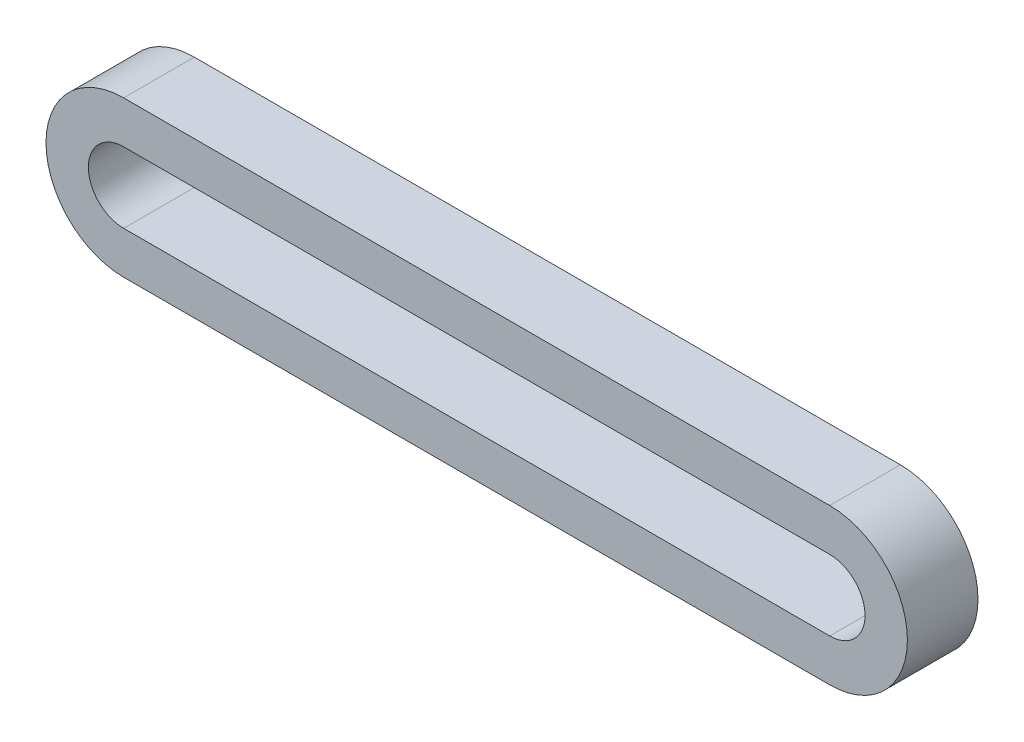
ISO-10303-21;
HEADER;
FILE_DESCRIPTION(('STEP AP214'),'2;1');
FILE_NAME('part.step','',(''),(''),'','','');
FILE_SCHEMA(('AUTOMOTIVE_DESIGN { 1 0 10303 214 1 1 1 1 }'));
ENDSEC;
DATA;
#1=APPLICATION_CONTEXT('core data for automotive mechanical design processes');
#2=APPLICATION_PROTOCOL_DEFINITION('international standard','automotive_design',2000,#1);
#3=PRODUCT_CONTEXT('',#1,'mechanical');
#4=PRODUCT('Part','Part','',(#3));
#5=PRODUCT_RELATED_PRODUCT_CATEGORY('part','',(#4));
#6=PRODUCT_DEFINITION_FORMATION('','',#4);
#7=PRODUCT_DEFINITION_CONTEXT('part definition',#1,'design');
#8=PRODUCT_DEFINITION('design','',#6,#7);
#9=PRODUCT_DEFINITION_SHAPE('','',#8);
#10=(LENGTH_UNIT() NAMED_UNIT(*) SI_UNIT(.MILLI.,.METRE.));
#11=(NAMED_UNIT(*) PLANE_ANGLE_UNIT() SI_UNIT($,.RADIAN.));
#12=(NAMED_UNIT(*) SI_UNIT($,.STERADIAN.) SOLID_ANGLE_UNIT());
#13=UNCERTAINTY_MEASURE_WITH_UNIT(LENGTH_MEASURE(1.E-05),#10,'distance_accuracy_value','');
#14=(GEOMETRIC_REPRESENTATION_CONTEXT(3) GLOBAL_UNCERTAINTY_ASSIGNED_CONTEXT((#13)) GLOBAL_UNIT_ASSIGNED_CONTEXT((#10,
#11,#12)) REPRESENTATION_CONTEXT('',''));
#15=CARTESIAN_POINT('',(0.,0.,0.));
#16=DIRECTION('',(0.,0.,1.));
#17=DIRECTION('',(1.,0.,0.));
#18=AXIS2_PLACEMENT_3D('',#15,#16,#17);
#19=CARTESIAN_POINT('',(0.,5.5,5.));
#20=DIRECTION('',(0.,1.,0.));
#21=DIRECTION('',(0.,0.,1.));
#22=AXIS2_PLACEMENT_3D('',#19,#20,#21);
#23=PLANE('',#22);
#24=DIRECTION('',(1.,0.,0.));
#25=VECTOR('',#24,1.);
#26=CARTESIAN_POINT('',(0.,5.5,0.));
#27=LINE('',#26,#25);
#28=CARTESIAN_POINT('',(0.,5.5,0.));
#29=VERTEX_POINT('',#28);
#30=CARTESIAN_POINT('',(50.,5.5,0.));
#31=VERTEX_POINT('',#30);
#32=EDGE_CURVE('E148',#29,#31,#27,.T.);
#33=ORIENTED_EDGE('',*,*,#32,.F.);
#34=DIRECTION('',(0.,0.,-1.));
#35=VECTOR('',#34,1.);
#36=CARTESIAN_POINT('',(0.,5.5,5.));
#37=LINE('',#36,#35);
#38=CARTESIAN_POINT('',(0.,5.5,5.));
#39=VERTEX_POINT('',#38);
#40=EDGE_CURVE('E11',#39,#29,#37,.T.);
#41=ORIENTED_EDGE('',*,*,#40,.F.);
#42=DIRECTION('',(1.,0.,0.));
#43=VECTOR('',#42,1.);
#44=CARTESIAN_POINT('',(0.,5.5,5.));
#45=LINE('',#44,#43);
#46=CARTESIAN_POINT('',(50.,5.5,5.));
#47=VERTEX_POINT('',#46);
#48=EDGE_CURVE('E122',#39,#47,#45,.T.);
#49=ORIENTED_EDGE('',*,*,#48,.T.);
#50=DIRECTION('',(0.,0.,-1.));
#51=VECTOR('',#50,1.);
#52=CARTESIAN_POINT('',(50.,5.5,5.));
#53=LINE('',#52,#51);
#54=EDGE_CURVE('E88',#47,#31,#53,.T.);
#55=ORIENTED_EDGE('',*,*,#54,.T.);
#56=EDGE_LOOP('',(#33,#41,#49,#55));
#57=FACE_BOUND('',#56,.T.);
#58=ADVANCED_FACE('F35',(#57),#23,.T.);
#59=CARTESIAN_POINT('',(0.,0.,5.));
#60=DIRECTION('',(0.,0.,-1.));
#61=DIRECTION('',(-1.,0.,0.));
#62=AXIS2_PLACEMENT_3D('',#59,#60,#61);
#63=CYLINDRICAL_SURFACE('',#62,5.5);
#64=CARTESIAN_POINT('',(0.,0.,0.));
#65=DIRECTION('',(0.,0.,1.));
#66=DIRECTION('',(1.,0.,0.));
#67=AXIS2_PLACEMENT_3D('',#64,#65,#66);
#68=CIRCLE('',#67,5.5);
#69=CARTESIAN_POINT('',(0.,-5.5,0.));
#70=VERTEX_POINT('',#69);
#71=EDGE_CURVE('E127',#29,#70,#68,.T.);
#72=ORIENTED_EDGE('',*,*,#71,.T.);
#73=DIRECTION('',(0.,0.,-1.));
#74=VECTOR('',#73,1.);
#75=CARTESIAN_POINT('',(0.,-5.5,5.));
#76=LINE('',#75,#74);
#77=CARTESIAN_POINT('',(0.,-5.5,5.));
#78=VERTEX_POINT('',#77);
#79=EDGE_CURVE('E45',#78,#70,#76,.T.);
#80=ORIENTED_EDGE('',*,*,#79,.F.);
#81=CARTESIAN_POINT('',(0.,0.,5.));
#82=DIRECTION('',(0.,0.,1.));
#83=DIRECTION('',(1.,0.,0.));
#84=AXIS2_PLACEMENT_3D('',#81,#82,#83);
#85=CIRCLE('',#84,5.5);
#86=EDGE_CURVE('E118',#39,#78,#85,.T.);
#87=ORIENTED_EDGE('',*,*,#86,.F.);
#88=ORIENTED_EDGE('',*,*,#40,.T.);
#89=EDGE_LOOP('',(#72,#80,#87,#88));
#90=FACE_BOUND('',#89,.T.);
#91=ADVANCED_FACE('F125',(#90),#63,.T.);
#92=CARTESIAN_POINT('',(0.,-5.5,5.));
#93=DIRECTION('',(0.,1.,0.));
#94=DIRECTION('',(0.,0.,1.));
#95=AXIS2_PLACEMENT_3D('',#92,#93,#94);
#96=PLANE('',#95);
#97=DIRECTION('',(1.,0.,0.));
#98=VECTOR('',#97,1.);
#99=CARTESIAN_POINT('',(0.,-5.5,0.));
#100=LINE('',#99,#98);
#101=CARTESIAN_POINT('',(50.,-5.5,0.));
#102=VERTEX_POINT('',#101);
#103=EDGE_CURVE('E145',#70,#102,#100,.T.);
#104=ORIENTED_EDGE('',*,*,#103,.T.);
#105=DIRECTION('',(0.,0.,-1.));
#106=VECTOR('',#105,1.);
#107=CARTESIAN_POINT('',(50.,-5.5,5.));
#108=LINE('',#107,#106);
#109=CARTESIAN_POINT('',(50.,-5.5,5.));
#110=VERTEX_POINT('',#109);
#111=EDGE_CURVE('E117',#110,#102,#108,.T.);
#112=ORIENTED_EDGE('',*,*,#111,.F.);
#113=DIRECTION('',(1.,0.,0.));
#114=VECTOR('',#113,1.);
#115=CARTESIAN_POINT('',(0.,-5.5,5.));
#116=LINE('',#115,#114);
#117=EDGE_CURVE('E111',#78,#110,#116,.T.);
#118=ORIENTED_EDGE('',*,*,#117,.F.);
#119=ORIENTED_EDGE('',*,*,#79,.T.);
#120=EDGE_LOOP('',(#104,#112,#118,#119));
#121=FACE_BOUND('',#120,.T.);
#122=ADVANCED_FACE('F114',(#121),#96,.F.);
#123=CARTESIAN_POINT('',(50.,0.,5.));
#124=DIRECTION('',(0.,0.,-1.));
#125=DIRECTION('',(-1.,0.,0.));
#126=AXIS2_PLACEMENT_3D('',#123,#124,#125);
#127=CYLINDRICAL_SURFACE('',#126,2.5);
#128=CARTESIAN_POINT('',(50.,0.,0.));
#129=DIRECTION('',(0.,0.,1.));
#130=DIRECTION('',(1.,0.,0.));
#131=AXIS2_PLACEMENT_3D('',#128,#129,#130);
#132=CIRCLE('',#131,2.5);
#133=CARTESIAN_POINT('',(50.,-2.5,0.));
#134=VERTEX_POINT('',#133);
#135=CARTESIAN_POINT('',(50.,2.5,0.));
#136=VERTEX_POINT('',#135);
#137=EDGE_CURVE('E159',#134,#136,#132,.T.);
#138=ORIENTED_EDGE('',*,*,#137,.F.);
#139=DIRECTION('',(0.,0.,-1.));
#140=VECTOR('',#139,1.);
#141=CARTESIAN_POINT('',(50.,-2.5,5.));
#142=LINE('',#141,#140);
#143=CARTESIAN_POINT('',(50.,-2.5,5.));
#144=VERTEX_POINT('',#143);
#145=EDGE_CURVE('E39',#144,#134,#142,.T.);
#146=ORIENTED_EDGE('',*,*,#145,.F.);
#147=CARTESIAN_POINT('',(50.,0.,5.));
#148=DIRECTION('',(0.,0.,1.));
#149=DIRECTION('',(1.,0.,0.));
#150=AXIS2_PLACEMENT_3D('',#147,#148,#149);
#151=CIRCLE('',#150,2.5);
#152=CARTESIAN_POINT('',(50.,2.5,5.));
#153=VERTEX_POINT('',#152);
#154=EDGE_CURVE('E144',#144,#153,#151,.T.);
#155=ORIENTED_EDGE('',*,*,#154,.T.);
#156=DIRECTION('',(0.,0.,-1.));
#157=VECTOR('',#156,1.);
#158=CARTESIAN_POINT('',(50.,2.5,5.));
#159=LINE('',#158,#157);
#160=EDGE_CURVE('E132',#153,#136,#159,.T.);
#161=ORIENTED_EDGE('',*,*,#160,.T.);
#162=EDGE_LOOP('',(#138,#146,#155,#161));
#163=FACE_BOUND('',#162,.T.);
#164=ADVANCED_FACE('F37',(#163),#127,.F.);
#165=CARTESIAN_POINT('',(0.,-2.5,5.));
#166=DIRECTION('',(0.,1.,0.));
#167=DIRECTION('',(0.,0.,1.));
#168=AXIS2_PLACEMENT_3D('',#165,#166,#167);
#169=PLANE('',#168);
#170=DIRECTION('',(1.,0.,0.));
#171=VECTOR('',#170,1.);
#172=CARTESIAN_POINT('',(0.,-2.5,0.));
#173=LINE('',#172,#171);
#174=CARTESIAN_POINT('',(0.,-2.5,0.));
#175=VERTEX_POINT('',#174);
#176=EDGE_CURVE('E156',#175,#134,#173,.T.);
#177=ORIENTED_EDGE('',*,*,#176,.F.);
#178=DIRECTION('',(0.,0.,-1.));
#179=VECTOR('',#178,1.);
#180=CARTESIAN_POINT('',(0.,-2.5,5.));
#181=LINE('',#180,#179);
#182=CARTESIAN_POINT('',(0.,-2.5,5.));
#183=VERTEX_POINT('',#182);
#184=EDGE_CURVE('E135',#183,#175,#181,.T.);
#185=ORIENTED_EDGE('',*,*,#184,.F.);
#186=DIRECTION('',(1.,0.,0.));
#187=VECTOR('',#186,1.);
#188=CARTESIAN_POINT('',(0.,-2.5,5.));
#189=LINE('',#188,#187);
#190=EDGE_CURVE('E168',#183,#144,#189,.T.);
#191=ORIENTED_EDGE('',*,*,#190,.T.);
#192=ORIENTED_EDGE('',*,*,#145,.T.);
#193=EDGE_LOOP('',(#177,#185,#191,#192));
#194=FACE_BOUND('',#193,.T.);
#195=ADVANCED_FACE('F175',(#194),#169,.T.);
#196=CARTESIAN_POINT('',(0.,0.,5.));
#197=DIRECTION('',(0.,0.,-1.));
#198=DIRECTION('',(-1.,0.,0.));
#199=AXIS2_PLACEMENT_3D('',#196,#197,#198);
#200=CYLINDRICAL_SURFACE('',#199,2.5);
#201=CARTESIAN_POINT('',(0.,0.,0.));
#202=DIRECTION('',(0.,0.,1.));
#203=DIRECTION('',(1.,0.,0.));
#204=AXIS2_PLACEMENT_3D('',#201,#202,#203);
#205=CIRCLE('',#204,2.5);
#206=CARTESIAN_POINT('',(0.,2.5,0.));
#207=VERTEX_POINT('',#206);
#208=EDGE_CURVE('E153',#207,#175,#205,.T.);
#209=ORIENTED_EDGE('',*,*,#208,.F.);
#210=DIRECTION('',(0.,0.,-1.));
#211=VECTOR('',#210,1.);
#212=CARTESIAN_POINT('',(0.,2.5,5.));
#213=LINE('',#212,#211);
#214=CARTESIAN_POINT('',(0.,2.5,5.));
#215=VERTEX_POINT('',#214);
#216=EDGE_CURVE('E134',#215,#207,#213,.T.);
#217=ORIENTED_EDGE('',*,*,#216,.F.);
#218=CARTESIAN_POINT('',(0.,0.,5.));
#219=DIRECTION('',(0.,0.,1.));
#220=DIRECTION('',(1.,0.,0.));
#221=AXIS2_PLACEMENT_3D('',#218,#219,#220);
#222=CIRCLE('',#221,2.5);
#223=EDGE_CURVE('E166',#215,#183,#222,.T.);
#224=ORIENTED_EDGE('',*,*,#223,.T.);
#225=ORIENTED_EDGE('',*,*,#184,.T.);
#226=EDGE_LOOP('',(#209,#217,#224,#225));
#227=FACE_BOUND('',#226,.T.);
#228=ADVANCED_FACE('F179',(#227),#200,.F.);
#229=CARTESIAN_POINT('',(0.,2.5,5.));
#230=DIRECTION('',(0.,1.,0.));
#231=DIRECTION('',(0.,0.,1.));
#232=AXIS2_PLACEMENT_3D('',#229,#230,#231);
#233=PLANE('',#232);
#234=DIRECTION('',(1.,0.,0.));
#235=VECTOR('',#234,1.);
#236=CARTESIAN_POINT('',(0.,2.5,0.));
#237=LINE('',#236,#235);
#238=EDGE_CURVE('E150',#207,#136,#237,.T.);
#239=ORIENTED_EDGE('',*,*,#238,.T.);
#240=ORIENTED_EDGE('',*,*,#160,.F.);
#241=DIRECTION('',(1.,0.,0.));
#242=VECTOR('',#241,1.);
#243=CARTESIAN_POINT('',(0.,2.5,5.));
#244=LINE('',#243,#242);
#245=EDGE_CURVE('E164',#215,#153,#244,.T.);
#246=ORIENTED_EDGE('',*,*,#245,.F.);
#247=ORIENTED_EDGE('',*,*,#216,.T.);
#248=EDGE_LOOP('',(#239,#240,#246,#247));
#249=FACE_BOUND('',#248,.T.);
#250=ADVANCED_FACE('F181',(#249),#233,.F.);
#251=CARTESIAN_POINT('',(50.,0.,5.));
#252=DIRECTION('',(0.,0.,-1.));
#253=DIRECTION('',(-1.,0.,0.));
#254=AXIS2_PLACEMENT_3D('',#251,#252,#253);
#255=CYLINDRICAL_SURFACE('',#254,5.5);
#256=CARTESIAN_POINT('',(50.,0.,0.));
#257=DIRECTION('',(0.,0.,1.));
#258=DIRECTION('',(1.,0.,0.));
#259=AXIS2_PLACEMENT_3D('',#256,#257,#258);
#260=CIRCLE('',#259,5.5);
#261=EDGE_CURVE('E81',#102,#31,#260,.T.);
#262=ORIENTED_EDGE('',*,*,#261,.T.);
#263=ORIENTED_EDGE('',*,*,#54,.F.);
#264=CARTESIAN_POINT('',(50.,0.,5.));
#265=DIRECTION('',(0.,0.,1.));
#266=DIRECTION('',(1.,0.,0.));
#267=AXIS2_PLACEMENT_3D('',#264,#265,#266);
#268=CIRCLE('',#267,5.5);
#269=EDGE_CURVE('E54',#110,#47,#268,.T.);
#270=ORIENTED_EDGE('',*,*,#269,.F.);
#271=ORIENTED_EDGE('',*,*,#111,.T.);
#272=EDGE_LOOP('',(#262,#263,#270,#271));
#273=FACE_BOUND('',#272,.T.);
#274=ADVANCED_FACE('F183',(#273),#255,.T.);
#275=CARTESIAN_POINT('',(0.,0.,5.));
#276=DIRECTION('',(0.,0.,1.));
#277=DIRECTION('',(1.,0.,0.));
#278=AXIS2_PLACEMENT_3D('',#275,#276,#277);
#279=PLANE('',#278);
#280=ORIENTED_EDGE('',*,*,#154,.F.);
#281=ORIENTED_EDGE('',*,*,#190,.F.);
#282=ORIENTED_EDGE('',*,*,#223,.F.);
#283=ORIENTED_EDGE('',*,*,#245,.T.);
#284=EDGE_LOOP('',(#280,#281,#282,#283));
#285=FACE_BOUND('',#284,.T.);
#286=ORIENTED_EDGE('',*,*,#48,.F.);
#287=ORIENTED_EDGE('',*,*,#86,.T.);
#288=ORIENTED_EDGE('',*,*,#117,.T.);
#289=ORIENTED_EDGE('',*,*,#269,.T.);
#290=EDGE_LOOP('',(#286,#287,#288,#289));
#291=FACE_BOUND('',#290,.T.);
#292=ADVANCED_FACE('F121',(#285,#291),#279,.T.);
#293=CARTESIAN_POINT('',(0.,0.,0.));
#294=DIRECTION('',(0.,0.,1.));
#295=DIRECTION('',(1.,0.,0.));
#296=AXIS2_PLACEMENT_3D('',#293,#294,#295);
#297=PLANE('',#296);
#298=ORIENTED_EDGE('',*,*,#137,.T.);
#299=ORIENTED_EDGE('',*,*,#238,.F.);
#300=ORIENTED_EDGE('',*,*,#208,.T.);
#301=ORIENTED_EDGE('',*,*,#176,.T.);
#302=EDGE_LOOP('',(#298,#299,#300,#301));
#303=FACE_BOUND('',#302,.T.);
#304=ORIENTED_EDGE('',*,*,#32,.T.);
#305=ORIENTED_EDGE('',*,*,#261,.F.);
#306=ORIENTED_EDGE('',*,*,#103,.F.);
#307=ORIENTED_EDGE('',*,*,#71,.F.);
#308=EDGE_LOOP('',(#304,#305,#306,#307));
#309=FACE_BOUND('',#308,.T.);
#310=ADVANCED_FACE('F178',(#303,#309),#297,.F.);
#311=CLOSED_SHELL('',(#58,#91,#122,#164,#195,#228,#250,#274,#292,#310));
#312=MANIFOLD_SOLID_BREP('B2',#311);
#313=ADVANCED_BREP_SHAPE_REPRESENTATION('',(#18,#312),#14);
#314=SHAPE_DEFINITION_REPRESENTATION(#9,#313);
ENDSEC;
END-ISO-10303-21;
